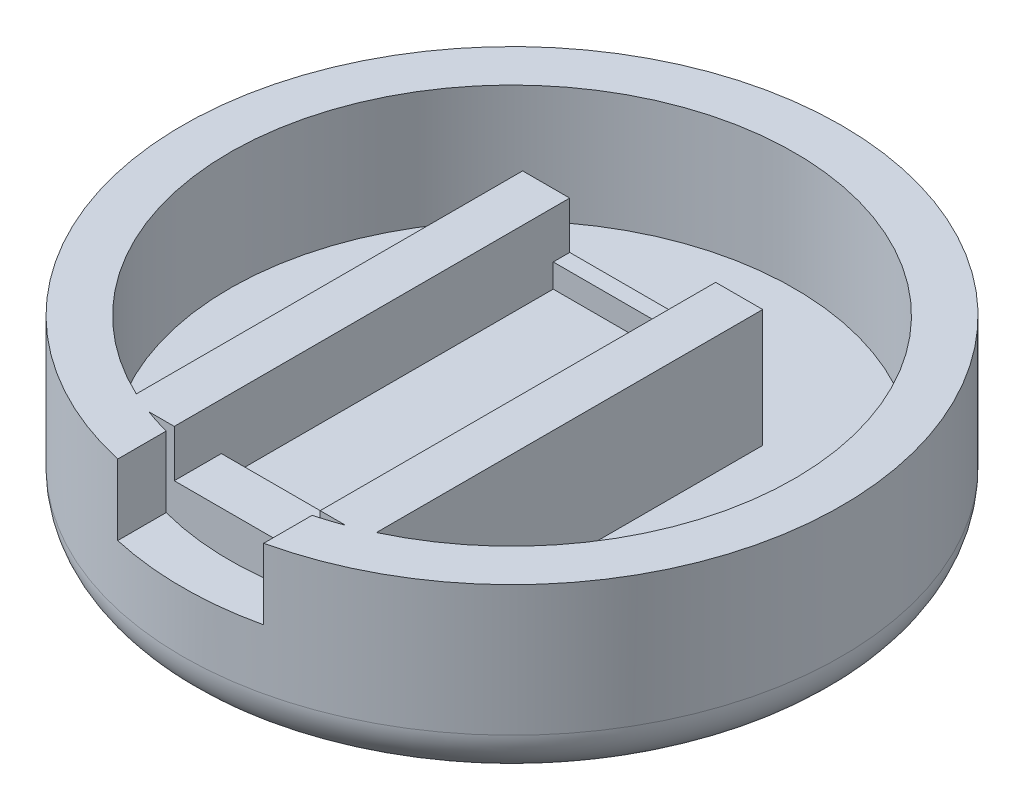
ISO-10303-21;
HEADER;
FILE_DESCRIPTION(('STEP AP214'),'2;1');
FILE_NAME('part.step','',(''),(''),'','','');
FILE_SCHEMA(('AUTOMOTIVE_DESIGN { 1 0 10303 214 1 1 1 1 }'));
ENDSEC;
DATA;
#1=APPLICATION_CONTEXT('core data for automotive mechanical design processes');
#2=APPLICATION_PROTOCOL_DEFINITION('international standard','automotive_design',2000,#1);
#3=PRODUCT_CONTEXT('',#1,'mechanical');
#4=PRODUCT('Part','Part','',(#3));
#5=PRODUCT_RELATED_PRODUCT_CATEGORY('part','',(#4));
#6=PRODUCT_DEFINITION_FORMATION('','',#4);
#7=PRODUCT_DEFINITION_CONTEXT('part definition',#1,'design');
#8=PRODUCT_DEFINITION('design','',#6,#7);
#9=PRODUCT_DEFINITION_SHAPE('','',#8);
#10=(LENGTH_UNIT() NAMED_UNIT(*) SI_UNIT(.MILLI.,.METRE.));
#11=(NAMED_UNIT(*) PLANE_ANGLE_UNIT() SI_UNIT($,.RADIAN.));
#12=(NAMED_UNIT(*) SI_UNIT($,.STERADIAN.) SOLID_ANGLE_UNIT());
#13=UNCERTAINTY_MEASURE_WITH_UNIT(LENGTH_MEASURE(1.E-05),#10,'distance_accuracy_value','');
#14=(GEOMETRIC_REPRESENTATION_CONTEXT(3) GLOBAL_UNCERTAINTY_ASSIGNED_CONTEXT((#13)) GLOBAL_UNIT_ASSIGNED_CONTEXT((#10,
#11,#12)) REPRESENTATION_CONTEXT('',''));
#15=CARTESIAN_POINT('',(0.,0.,0.));
#16=DIRECTION('',(0.,0.,1.));
#17=DIRECTION('',(1.,0.,0.));
#18=AXIS2_PLACEMENT_3D('',#15,#16,#17);
#19=CARTESIAN_POINT('',(0.,3.,0.));
#20=DIRECTION('',(0.,-1.,0.));
#21=DIRECTION('',(0.,0.,-1.));
#22=AXIS2_PLACEMENT_3D('',#19,#20,#21);
#23=PLANE('',#22);
#24=DIRECTION('',(0.,0.,-1.));
#25=VECTOR('',#24,1.);
#26=CARTESIAN_POINT('',(-32.7271495714285,3.,22.0919052857143));
#27=LINE('',#26,#25);
#28=CARTESIAN_POINT('',(-32.7271495714285,3.,16.8747175892936));
#29=VERTEX_POINT('',#28);
#30=CARTESIAN_POINT('',(-32.7271495714285,3.,14.8149153836684));
#31=VERTEX_POINT('',#30);
#32=EDGE_CURVE('E157',#29,#31,#27,.T.);
#33=ORIENTED_EDGE('',*,*,#32,.T.);
#34=CARTESIAN_POINT('',(-29.6271495714285,3.,3.22224528571427));
#35=DIRECTION('',(0.,-1.,0.));
#36=DIRECTION('',(0.,0.,-1.));
#37=AXIS2_PLACEMENT_3D('',#34,#35,#36);
#38=CIRCLE('',#37,12.);
#39=CARTESIAN_POINT('',(-33.8038887163118,3.,14.4719052857143));
#40=VERTEX_POINT('',#39);
#41=EDGE_CURVE('E56',#40,#31,#38,.F.);
#42=ORIENTED_EDGE('',*,*,#41,.F.);
#43=DIRECTION('',(1.,0.,0.));
#44=VECTOR('',#43,1.);
#45=CARTESIAN_POINT('',(-24.5271495714285,3.,14.4719052857143));
#46=LINE('',#45,#44);
#47=CARTESIAN_POINT('',(-32.7271495714285,3.,14.4719052857143));
#48=VERTEX_POINT('',#47);
#49=EDGE_CURVE('E269',#40,#48,#46,.T.);
#50=ORIENTED_EDGE('',*,*,#49,.T.);
#51=DIRECTION('',(0.,0.,1.));
#52=VECTOR('',#51,1.);
#53=CARTESIAN_POINT('',(-32.7271495714285,3.,-1.62809471428573));
#54=LINE('',#53,#52);
#55=CARTESIAN_POINT('',(-32.7271495714285,3.,-2.32809471428573));
#56=VERTEX_POINT('',#55);
#57=EDGE_CURVE('E240',#56,#48,#54,.T.);
#58=ORIENTED_EDGE('',*,*,#57,.F.);
#59=DIRECTION('',(-1.,0.,0.));
#60=VECTOR('',#59,1.);
#61=CARTESIAN_POINT('',(-34.7271495714285,3.,-2.32809471428573));
#62=LINE('',#61,#60);
#63=CARTESIAN_POINT('',(-34.7271495714285,3.,-2.32809471428573));
#64=VERTEX_POINT('',#63);
#65=EDGE_CURVE('E273',#56,#64,#62,.T.);
#66=ORIENTED_EDGE('',*,*,#65,.T.);
#67=DIRECTION('',(0.,0.,1.));
#68=VECTOR('',#67,1.);
#69=CARTESIAN_POINT('',(-34.7271495714285,3.,14.4719052857143));
#70=LINE('',#69,#68);
#71=CARTESIAN_POINT('',(-34.7271495714285,3.,14.0845654798533));
#72=VERTEX_POINT('',#71);
#73=EDGE_CURVE('E265',#64,#72,#70,.T.);
#74=ORIENTED_EDGE('',*,*,#73,.T.);
#75=CARTESIAN_POINT('',(-24.5271495714285,3.,14.0845654798533));
#76=VERTEX_POINT('',#75);
#77=EDGE_CURVE('E178',#76,#72,#38,.F.);
#78=ORIENTED_EDGE('',*,*,#77,.F.);
#79=DIRECTION('',(0.,0.,-1.));
#80=VECTOR('',#79,1.);
#81=CARTESIAN_POINT('',(-24.5271495714285,3.,-2.32809471428573));
#82=LINE('',#81,#80);
#83=CARTESIAN_POINT('',(-24.5271495714285,3.,-2.32809471428573));
#84=VERTEX_POINT('',#83);
#85=EDGE_CURVE('E271',#76,#84,#82,.T.);
#86=ORIENTED_EDGE('',*,*,#85,.T.);
#87=CARTESIAN_POINT('',(-26.5271495714285,3.,-2.32809471428573));
#88=VERTEX_POINT('',#87);
#89=EDGE_CURVE('E274',#84,#88,#62,.T.);
#90=ORIENTED_EDGE('',*,*,#89,.T.);
#91=DIRECTION('',(0.,0.,-1.));
#92=VECTOR('',#91,1.);
#93=CARTESIAN_POINT('',(-26.5271495714285,3.,12.4719052857143));
#94=LINE('',#93,#92);
#95=CARTESIAN_POINT('',(-26.5271495714285,3.,14.4719052857143));
#96=VERTEX_POINT('',#95);
#97=EDGE_CURVE('E243',#96,#88,#94,.T.);
#98=ORIENTED_EDGE('',*,*,#97,.F.);
#99=CARTESIAN_POINT('',(-25.4504104265453,3.,14.4719052857143));
#100=VERTEX_POINT('',#99);
#101=EDGE_CURVE('E268',#96,#100,#46,.T.);
#102=ORIENTED_EDGE('',*,*,#101,.T.);
#103=CARTESIAN_POINT('',(-26.5271495714285,3.,14.8149153836684));
#104=VERTEX_POINT('',#103);
#105=EDGE_CURVE('E181',#104,#100,#38,.F.);
#106=ORIENTED_EDGE('',*,*,#105,.F.);
#107=DIRECTION('',(0.,0.,-1.));
#108=VECTOR('',#107,1.);
#109=CARTESIAN_POINT('',(-26.5271495714285,3.,22.0919052857143));
#110=LINE('',#109,#108);
#111=CARTESIAN_POINT('',(-26.5271495714285,3.,16.8747175892936));
#112=VERTEX_POINT('',#111);
#113=EDGE_CURVE('E166',#112,#104,#110,.T.);
#114=ORIENTED_EDGE('',*,*,#113,.F.);
#115=CARTESIAN_POINT('',(-29.6271495714285,3.,3.22224528571427));
#116=DIRECTION('',(0.,-1.,0.));
#117=DIRECTION('',(0.,0.,-1.));
#118=AXIS2_PLACEMENT_3D('',#115,#116,#117);
#119=CIRCLE('',#118,14.);
#120=EDGE_CURVE('E173',#112,#29,#119,.F.);
#121=ORIENTED_EDGE('',*,*,#120,.T.);
#122=EDGE_LOOP('',(#33,#42,#50,#58,#66,#74,#78,#86,#90,#98,#102,#106,#114,#121));
#123=FACE_BOUND('',#122,.T.);
#124=ADVANCED_FACE('F33',(#123),#23,.F.);
#125=CARTESIAN_POINT('',(-29.6271495714285,42.5979797464467,3.22224528571427));
#126=DIRECTION('',(0.,-1.,0.));
#127=DIRECTION('',(0.,0.,-1.));
#128=AXIS2_PLACEMENT_3D('',#125,#126,#127);
#129=CYLINDRICAL_SURFACE('',#128,12.);
#130=DIRECTION('',(0.,-1.,0.));
#131=VECTOR('',#130,1.);
#132=CARTESIAN_POINT('',(-32.7271495714285,42.5979797464467,14.8149153836684));
#133=LINE('',#132,#131);
#134=CARTESIAN_POINT('',(-32.7271495714285,0.,14.8149153836684));
#135=VERTEX_POINT('',#134);
#136=EDGE_CURVE('E164',#135,#31,#133,.F.);
#137=ORIENTED_EDGE('',*,*,#136,.F.);
#138=CARTESIAN_POINT('',(-29.6271495714285,0.,3.22224528571427));
#139=DIRECTION('',(0.,1.,0.));
#140=DIRECTION('',(0.,0.,1.));
#141=AXIS2_PLACEMENT_3D('',#138,#139,#140);
#142=CIRCLE('',#141,12.);
#143=CARTESIAN_POINT('',(-26.5271495714285,0.,14.8149153836684));
#144=VERTEX_POINT('',#143);
#145=EDGE_CURVE('E508',#144,#135,#142,.F.);
#146=ORIENTED_EDGE('',*,*,#145,.F.);
#147=DIRECTION('',(0.,-1.,0.));
#148=VECTOR('',#147,1.);
#149=CARTESIAN_POINT('',(-26.5271495714285,42.5979797464467,14.8149153836684));
#150=LINE('',#149,#148);
#151=EDGE_CURVE('E510',#104,#144,#150,.T.);
#152=ORIENTED_EDGE('',*,*,#151,.F.);
#153=ORIENTED_EDGE('',*,*,#105,.T.);
#154=DIRECTION('',(0.,-1.,0.));
#155=VECTOR('',#154,1.);
#156=CARTESIAN_POINT('',(-25.4504104265453,42.5979797464467,14.4719052857143));
#157=LINE('',#156,#155);
#158=CARTESIAN_POINT('',(-25.4504104265453,-2.,14.4719052857143));
#159=VERTEX_POINT('',#158);
#160=EDGE_CURVE('E195',#100,#159,#157,.T.);
#161=ORIENTED_EDGE('',*,*,#160,.T.);
#162=CARTESIAN_POINT('',(-29.6271495714285,-2.,3.22224528571427));
#163=DIRECTION('',(0.,-1.,0.));
#164=DIRECTION('',(0.,0.,-1.));
#165=AXIS2_PLACEMENT_3D('',#162,#163,#164);
#166=CIRCLE('',#165,12.);
#167=CARTESIAN_POINT('',(-33.8038887163118,-2.,14.4719052857143));
#168=VERTEX_POINT('',#167);
#169=EDGE_CURVE('E179',#159,#168,#166,.T.);
#170=ORIENTED_EDGE('',*,*,#169,.T.);
#171=DIRECTION('',(0.,-1.,0.));
#172=VECTOR('',#171,1.);
#173=CARTESIAN_POINT('',(-33.8038887163118,42.5979797464467,14.4719052857143));
#174=LINE('',#173,#172);
#175=EDGE_CURVE('E193',#168,#40,#174,.F.);
#176=ORIENTED_EDGE('',*,*,#175,.T.);
#177=ORIENTED_EDGE('',*,*,#41,.T.);
#178=EDGE_LOOP('',(#137,#146,#152,#153,#161,#170,#176,#177));
#179=FACE_BOUND('',#178,.T.);
#180=ADVANCED_FACE('F298',(#179),#129,.F.);
#181=CARTESIAN_POINT('',(-29.6271495714285,42.5979797464467,3.22224528571427));
#182=DIRECTION('',(0.,-1.,0.));
#183=DIRECTION('',(0.,0.,-1.));
#184=AXIS2_PLACEMENT_3D('',#181,#182,#183);
#185=CYLINDRICAL_SURFACE('',#184,14.);
#186=CARTESIAN_POINT('',(-29.6271495714285,-2.54,3.22224528571427));
#187=DIRECTION('',(0.,-1.,0.));
#188=DIRECTION('',(0.,0.,-1.));
#189=AXIS2_PLACEMENT_3D('',#186,#187,#188);
#190=CIRCLE('',#189,14.);
#191=CARTESIAN_POINT('',(-29.6271495714285,-2.54,-10.7777547142857));
#192=VERTEX_POINT('',#191);
#193=EDGE_CURVE('E11',#192,#192,#190,.F.);
#194=ORIENTED_EDGE('',*,*,#193,.T.);
#195=EDGE_LOOP('',(#194));
#196=FACE_BOUND('',#195,.T.);
#197=CARTESIAN_POINT('',(-29.6271495714285,0.,3.22224528571427));
#198=DIRECTION('',(0.,1.,0.));
#199=DIRECTION('',(0.,0.,1.));
#200=AXIS2_PLACEMENT_3D('',#197,#198,#199);
#201=CIRCLE('',#200,14.);
#202=CARTESIAN_POINT('',(-26.5271495714285,0.,16.8747175892936));
#203=VERTEX_POINT('',#202);
#204=CARTESIAN_POINT('',(-32.7271495714285,0.,16.8747175892936));
#205=VERTEX_POINT('',#204);
#206=EDGE_CURVE('E174',#203,#205,#201,.F.);
#207=ORIENTED_EDGE('',*,*,#206,.T.);
#208=DIRECTION('',(0.,-1.,0.));
#209=VECTOR('',#208,1.);
#210=CARTESIAN_POINT('',(-32.7271495714285,42.5979797464467,16.8747175892936));
#211=LINE('',#210,#209);
#212=EDGE_CURVE('E161',#205,#29,#211,.F.);
#213=ORIENTED_EDGE('',*,*,#212,.T.);
#214=ORIENTED_EDGE('',*,*,#120,.F.);
#215=DIRECTION('',(0.,-1.,0.));
#216=VECTOR('',#215,1.);
#217=CARTESIAN_POINT('',(-26.5271495714285,42.5979797464467,16.8747175892936));
#218=LINE('',#217,#216);
#219=EDGE_CURVE('E281',#112,#203,#218,.T.);
#220=ORIENTED_EDGE('',*,*,#219,.T.);
#221=EDGE_LOOP('',(#207,#213,#214,#220));
#222=FACE_BOUND('',#221,.T.);
#223=ADVANCED_FACE('F171',(#196,#222),#185,.T.);
#224=CARTESIAN_POINT('',(-34.7271495714285,3.,14.4719052857143));
#225=DIRECTION('',(1.,0.,0.));
#226=DIRECTION('',(0.,0.,-1.));
#227=AXIS2_PLACEMENT_3D('',#224,#225,#226);
#228=PLANE('',#227);
#229=DIRECTION('',(0.,-1.,0.));
#230=VECTOR('',#229,1.);
#231=CARTESIAN_POINT('',(-34.7271495714285,42.5979797464467,14.0845654798533));
#232=LINE('',#231,#230);
#233=CARTESIAN_POINT('',(-34.7271495714285,-2.,14.0845654798533));
#234=VERTEX_POINT('',#233);
#235=EDGE_CURVE('E197',#72,#234,#232,.T.);
#236=ORIENTED_EDGE('',*,*,#235,.F.);
#237=ORIENTED_EDGE('',*,*,#73,.F.);
#238=DIRECTION('',(0.,-1.,0.));
#239=VECTOR('',#238,1.);
#240=CARTESIAN_POINT('',(-34.7271495714285,3.,-2.32809471428573));
#241=LINE('',#240,#239);
#242=CARTESIAN_POINT('',(-34.7271495714285,-2.,-2.32809471428573));
#243=VERTEX_POINT('',#242);
#244=EDGE_CURVE('E277',#64,#243,#241,.T.);
#245=ORIENTED_EDGE('',*,*,#244,.T.);
#246=DIRECTION('',(0.,0.,-1.));
#247=VECTOR('',#246,1.);
#248=CARTESIAN_POINT('',(-34.7271495714285,-2.,14.4719052857143));
#249=LINE('',#248,#247);
#250=EDGE_CURVE('E199',#234,#243,#249,.T.);
#251=ORIENTED_EDGE('',*,*,#250,.F.);
#252=EDGE_LOOP('',(#236,#237,#245,#251));
#253=FACE_BOUND('',#252,.T.);
#254=ADVANCED_FACE('F321',(#253),#228,.F.);
#255=CARTESIAN_POINT('',(-24.5271495714285,3.,14.4719052857143));
#256=DIRECTION('',(0.,0.,-1.));
#257=DIRECTION('',(-1.,0.,0.));
#258=AXIS2_PLACEMENT_3D('',#255,#256,#257);
#259=PLANE('',#258);
#260=DIRECTION('',(1.,0.,0.));
#261=VECTOR('',#260,1.);
#262=CARTESIAN_POINT('',(-32.7271495714285,1.,14.4719052857143));
#263=LINE('',#262,#261);
#264=CARTESIAN_POINT('',(-32.7271495714285,1.,14.4719052857143));
#265=VERTEX_POINT('',#264);
#266=CARTESIAN_POINT('',(-26.5271495714285,1.,14.4719052857143));
#267=VERTEX_POINT('',#266);
#268=EDGE_CURVE('E214',#265,#267,#263,.T.);
#269=ORIENTED_EDGE('',*,*,#268,.F.);
#270=DIRECTION('',(0.,-1.,0.));
#271=VECTOR('',#270,1.);
#272=CARTESIAN_POINT('',(-32.7271495714285,3.,14.4719052857143));
#273=LINE('',#272,#271);
#274=EDGE_CURVE('E211',#48,#265,#273,.T.);
#275=ORIENTED_EDGE('',*,*,#274,.F.);
#276=ORIENTED_EDGE('',*,*,#49,.F.);
#277=ORIENTED_EDGE('',*,*,#175,.F.);
#278=DIRECTION('',(-1.,0.,0.));
#279=VECTOR('',#278,1.);
#280=CARTESIAN_POINT('',(-34.7271495714285,-2.,14.4719052857143));
#281=LINE('',#280,#279);
#282=EDGE_CURVE('E208',#159,#168,#281,.T.);
#283=ORIENTED_EDGE('',*,*,#282,.F.);
#284=ORIENTED_EDGE('',*,*,#160,.F.);
#285=ORIENTED_EDGE('',*,*,#101,.F.);
#286=DIRECTION('',(0.,1.,0.));
#287=VECTOR('',#286,1.);
#288=CARTESIAN_POINT('',(-26.5271495714285,3.,14.4719052857143));
#289=LINE('',#288,#287);
#290=EDGE_CURVE('E217',#267,#96,#289,.T.);
#291=ORIENTED_EDGE('',*,*,#290,.F.);
#292=EDGE_LOOP('',(#269,#275,#276,#277,#283,#284,#285,#291));
#293=FACE_BOUND('',#292,.T.);
#294=ADVANCED_FACE('F318',(#293),#259,.F.);
#295=CARTESIAN_POINT('',(-24.5271495714285,3.,-2.32809471428573));
#296=DIRECTION('',(-1.,0.,0.));
#297=DIRECTION('',(0.,0.,1.));
#298=AXIS2_PLACEMENT_3D('',#295,#296,#297);
#299=PLANE('',#298);
#300=DIRECTION('',(0.,-1.,0.));
#301=VECTOR('',#300,1.);
#302=CARTESIAN_POINT('',(-24.5271495714285,42.5979797464467,14.0845654798533));
#303=LINE('',#302,#301);
#304=CARTESIAN_POINT('',(-24.5271495714285,-2.,14.0845654798533));
#305=VERTEX_POINT('',#304);
#306=EDGE_CURVE('E190',#305,#76,#303,.F.);
#307=ORIENTED_EDGE('',*,*,#306,.F.);
#308=DIRECTION('',(0.,0.,1.));
#309=VECTOR('',#308,1.);
#310=CARTESIAN_POINT('',(-24.5271495714285,-2.,14.4719052857143));
#311=LINE('',#310,#309);
#312=CARTESIAN_POINT('',(-24.5271495714285,-2.,-2.32809471428573));
#313=VERTEX_POINT('',#312);
#314=EDGE_CURVE('E205',#313,#305,#311,.T.);
#315=ORIENTED_EDGE('',*,*,#314,.F.);
#316=DIRECTION('',(0.,-1.,0.));
#317=VECTOR('',#316,1.);
#318=CARTESIAN_POINT('',(-24.5271495714285,3.,-2.32809471428573));
#319=LINE('',#318,#317);
#320=EDGE_CURVE('E279',#84,#313,#319,.T.);
#321=ORIENTED_EDGE('',*,*,#320,.F.);
#322=ORIENTED_EDGE('',*,*,#85,.F.);
#323=EDGE_LOOP('',(#307,#315,#321,#322));
#324=FACE_BOUND('',#323,.T.);
#325=ADVANCED_FACE('F314',(#324),#299,.F.);
#326=CARTESIAN_POINT('',(-34.7271495714285,3.,-2.32809471428573));
#327=DIRECTION('',(0.,0.,1.));
#328=DIRECTION('',(1.,0.,0.));
#329=AXIS2_PLACEMENT_3D('',#326,#327,#328);
#330=PLANE('',#329);
#331=ORIENTED_EDGE('',*,*,#65,.F.);
#332=DIRECTION('',(0.,-1.,0.));
#333=VECTOR('',#332,1.);
#334=CARTESIAN_POINT('',(-32.7271495714285,3.,-2.32809471428573));
#335=LINE('',#334,#333);
#336=CARTESIAN_POINT('',(-32.7271495714285,1.,-2.32809471428573));
#337=VERTEX_POINT('',#336);
#338=EDGE_CURVE('E236',#56,#337,#335,.T.);
#339=ORIENTED_EDGE('',*,*,#338,.T.);
#340=DIRECTION('',(1.,0.,0.));
#341=VECTOR('',#340,1.);
#342=CARTESIAN_POINT('',(-34.7271495714285,1.,-2.32809471428573));
#343=LINE('',#342,#341);
#344=CARTESIAN_POINT('',(-26.5271495714285,1.,-2.32809471428573));
#345=VERTEX_POINT('',#344);
#346=EDGE_CURVE('E230',#337,#345,#343,.T.);
#347=ORIENTED_EDGE('',*,*,#346,.T.);
#348=DIRECTION('',(0.,1.,0.));
#349=VECTOR('',#348,1.);
#350=CARTESIAN_POINT('',(-26.5271495714285,3.,-2.32809471428573));
#351=LINE('',#350,#349);
#352=EDGE_CURVE('E233',#345,#88,#351,.T.);
#353=ORIENTED_EDGE('',*,*,#352,.T.);
#354=ORIENTED_EDGE('',*,*,#89,.F.);
#355=ORIENTED_EDGE('',*,*,#320,.T.);
#356=DIRECTION('',(1.,0.,0.));
#357=VECTOR('',#356,1.);
#358=CARTESIAN_POINT('',(-34.7271495714285,-2.,-2.32809471428573));
#359=LINE('',#358,#357);
#360=EDGE_CURVE('E202',#243,#313,#359,.T.);
#361=ORIENTED_EDGE('',*,*,#360,.F.);
#362=ORIENTED_EDGE('',*,*,#244,.F.);
#363=EDGE_LOOP('',(#331,#339,#347,#353,#354,#355,#361,#362));
#364=FACE_BOUND('',#363,.T.);
#365=ADVANCED_FACE('F311',(#364),#330,.F.);
#366=CARTESIAN_POINT('',(-26.5271495714285,3.,-1.62809471428573));
#367=DIRECTION('',(0.,0.,1.));
#368=DIRECTION('',(1.,0.,0.));
#369=AXIS2_PLACEMENT_3D('',#366,#367,#368);
#370=PLANE('',#369);
#371=DIRECTION('',(1.,0.,0.));
#372=VECTOR('',#371,1.);
#373=CARTESIAN_POINT('',(-26.5271495714285,1.,-1.62809471428573));
#374=LINE('',#373,#372);
#375=CARTESIAN_POINT('',(-32.7271495714285,1.,-1.62809471428573));
#376=VERTEX_POINT('',#375);
#377=CARTESIAN_POINT('',(-26.5271495714285,1.,-1.62809471428573));
#378=VERTEX_POINT('',#377);
#379=EDGE_CURVE('E228',#376,#378,#374,.T.);
#380=ORIENTED_EDGE('',*,*,#379,.F.);
#381=DIRECTION('',(0.,-1.,0.));
#382=VECTOR('',#381,1.);
#383=CARTESIAN_POINT('',(-32.7271495714285,3.,-1.62809471428573));
#384=LINE('',#383,#382);
#385=CARTESIAN_POINT('',(-32.7271495714285,0.,-1.62809471428573));
#386=VERTEX_POINT('',#385);
#387=EDGE_CURVE('E263',#376,#386,#384,.T.);
#388=ORIENTED_EDGE('',*,*,#387,.T.);
#389=DIRECTION('',(-1.,0.,0.));
#390=VECTOR('',#389,1.);
#391=CARTESIAN_POINT('',(-26.5271495714285,0.,-1.62809471428573));
#392=LINE('',#391,#390);
#393=CARTESIAN_POINT('',(-26.5271495714285,0.,-1.62809471428573));
#394=VERTEX_POINT('',#393);
#395=EDGE_CURVE('E239',#394,#386,#392,.T.);
#396=ORIENTED_EDGE('',*,*,#395,.F.);
#397=DIRECTION('',(0.,-1.,0.));
#398=VECTOR('',#397,1.);
#399=CARTESIAN_POINT('',(-26.5271495714285,3.,-1.62809471428573));
#400=LINE('',#399,#398);
#401=EDGE_CURVE('E246',#378,#394,#400,.T.);
#402=ORIENTED_EDGE('',*,*,#401,.F.);
#403=EDGE_LOOP('',(#380,#388,#396,#402));
#404=FACE_BOUND('',#403,.T.);
#405=ADVANCED_FACE('F309',(#404),#370,.T.);
#406=CARTESIAN_POINT('',(-32.7271495714285,3.,-1.62809471428573));
#407=DIRECTION('',(1.,0.,0.));
#408=DIRECTION('',(0.,0.,-1.));
#409=AXIS2_PLACEMENT_3D('',#406,#407,#408);
#410=PLANE('',#409);
#411=ORIENTED_EDGE('',*,*,#387,.F.);
#412=DIRECTION('',(0.,0.,1.));
#413=VECTOR('',#412,1.);
#414=CARTESIAN_POINT('',(-32.7271495714285,1.,-10.9280947142857));
#415=LINE('',#414,#413);
#416=EDGE_CURVE('E224',#337,#376,#415,.T.);
#417=ORIENTED_EDGE('',*,*,#416,.F.);
#418=ORIENTED_EDGE('',*,*,#338,.F.);
#419=ORIENTED_EDGE('',*,*,#57,.T.);
#420=ORIENTED_EDGE('',*,*,#274,.T.);
#421=CARTESIAN_POINT('',(-32.7271495714285,1.,12.4719052857143));
#422=VERTEX_POINT('',#421);
#423=EDGE_CURVE('E220',#422,#265,#415,.T.);
#424=ORIENTED_EDGE('',*,*,#423,.F.);
#425=DIRECTION('',(0.,-1.,0.));
#426=VECTOR('',#425,1.);
#427=CARTESIAN_POINT('',(-32.7271495714285,3.,12.4719052857143));
#428=LINE('',#427,#426);
#429=CARTESIAN_POINT('',(-32.7271495714285,0.,12.4719052857143));
#430=VERTEX_POINT('',#429);
#431=EDGE_CURVE('E261',#422,#430,#428,.T.);
#432=ORIENTED_EDGE('',*,*,#431,.T.);
#433=DIRECTION('',(0.,0.,1.));
#434=VECTOR('',#433,1.);
#435=CARTESIAN_POINT('',(-32.7271495714285,0.,-1.62809471428573));
#436=LINE('',#435,#434);
#437=EDGE_CURVE('E249',#386,#430,#436,.T.);
#438=ORIENTED_EDGE('',*,*,#437,.F.);
#439=EDGE_LOOP('',(#411,#417,#418,#419,#420,#424,#432,#438));
#440=FACE_BOUND('',#439,.T.);
#441=ADVANCED_FACE('F362',(#440),#410,.T.);
#442=CARTESIAN_POINT('',(-32.7271495714285,3.,12.4719052857143));
#443=DIRECTION('',(0.,0.,-1.));
#444=DIRECTION('',(-1.,0.,0.));
#445=AXIS2_PLACEMENT_3D('',#442,#443,#444);
#446=PLANE('',#445);
#447=DIRECTION('',(-1.,0.,0.));
#448=VECTOR('',#447,1.);
#449=CARTESIAN_POINT('',(-32.7271495714285,1.,12.4719052857143));
#450=LINE('',#449,#448);
#451=CARTESIAN_POINT('',(-26.5271495714285,1.,12.4719052857143));
#452=VERTEX_POINT('',#451);
#453=EDGE_CURVE('E226',#452,#422,#450,.T.);
#454=ORIENTED_EDGE('',*,*,#453,.F.);
#455=DIRECTION('',(0.,-1.,0.));
#456=VECTOR('',#455,1.);
#457=CARTESIAN_POINT('',(-26.5271495714285,3.,12.4719052857143));
#458=LINE('',#457,#456);
#459=CARTESIAN_POINT('',(-26.5271495714285,0.,12.4719052857143));
#460=VERTEX_POINT('',#459);
#461=EDGE_CURVE('E258',#452,#460,#458,.T.);
#462=ORIENTED_EDGE('',*,*,#461,.T.);
#463=DIRECTION('',(1.,0.,0.));
#464=VECTOR('',#463,1.);
#465=CARTESIAN_POINT('',(-32.7271495714285,0.,12.4719052857143));
#466=LINE('',#465,#464);
#467=EDGE_CURVE('E252',#430,#460,#466,.T.);
#468=ORIENTED_EDGE('',*,*,#467,.F.);
#469=ORIENTED_EDGE('',*,*,#431,.F.);
#470=EDGE_LOOP('',(#454,#462,#468,#469));
#471=FACE_BOUND('',#470,.T.);
#472=ADVANCED_FACE('F370',(#471),#446,.T.);
#473=CARTESIAN_POINT('',(-26.5271495714285,3.,12.4719052857143));
#474=DIRECTION('',(-1.,0.,0.));
#475=DIRECTION('',(0.,0.,1.));
#476=AXIS2_PLACEMENT_3D('',#473,#474,#475);
#477=PLANE('',#476);
#478=ORIENTED_EDGE('',*,*,#461,.F.);
#479=DIRECTION('',(0.,0.,1.));
#480=VECTOR('',#479,1.);
#481=CARTESIAN_POINT('',(-26.5271495714285,1.,-10.9280947142857));
#482=LINE('',#481,#480);
#483=EDGE_CURVE('E221',#452,#267,#482,.T.);
#484=ORIENTED_EDGE('',*,*,#483,.T.);
#485=ORIENTED_EDGE('',*,*,#290,.T.);
#486=ORIENTED_EDGE('',*,*,#97,.T.);
#487=ORIENTED_EDGE('',*,*,#352,.F.);
#488=EDGE_CURVE('E223',#345,#378,#482,.T.);
#489=ORIENTED_EDGE('',*,*,#488,.T.);
#490=ORIENTED_EDGE('',*,*,#401,.T.);
#491=DIRECTION('',(0.,0.,-1.));
#492=VECTOR('',#491,1.);
#493=CARTESIAN_POINT('',(-26.5271495714285,0.,12.4719052857143));
#494=LINE('',#493,#492);
#495=EDGE_CURVE('E244',#460,#394,#494,.T.);
#496=ORIENTED_EDGE('',*,*,#495,.F.);
#497=EDGE_LOOP('',(#478,#484,#485,#486,#487,#489,#490,#496));
#498=FACE_BOUND('',#497,.T.);
#499=ADVANCED_FACE('F351',(#498),#477,.T.);
#500=CARTESIAN_POINT('',(-32.7271495714285,1.,-10.9280947142857));
#501=DIRECTION('',(0.,-1.,0.));
#502=DIRECTION('',(0.,0.,-1.));
#503=AXIS2_PLACEMENT_3D('',#500,#501,#502);
#504=PLANE('',#503);
#505=ORIENTED_EDGE('',*,*,#453,.T.);
#506=ORIENTED_EDGE('',*,*,#423,.T.);
#507=ORIENTED_EDGE('',*,*,#268,.T.);
#508=ORIENTED_EDGE('',*,*,#483,.F.);
#509=EDGE_LOOP('',(#505,#506,#507,#508));
#510=FACE_BOUND('',#509,.T.);
#511=ADVANCED_FACE('F372',(#510),#504,.F.);
#512=ORIENTED_EDGE('',*,*,#416,.T.);
#513=ORIENTED_EDGE('',*,*,#379,.T.);
#514=ORIENTED_EDGE('',*,*,#488,.F.);
#515=ORIENTED_EDGE('',*,*,#346,.F.);
#516=EDGE_LOOP('',(#512,#513,#514,#515));
#517=FACE_BOUND('',#516,.T.);
#518=ADVANCED_FACE('F354',(#517),#504,.F.);
#519=CARTESIAN_POINT('',(0.,0.,0.));
#520=DIRECTION('',(0.,-1.,0.));
#521=DIRECTION('',(0.,0.,-1.));
#522=AXIS2_PLACEMENT_3D('',#519,#520,#521);
#523=PLANE('',#522);
#524=ORIENTED_EDGE('',*,*,#467,.T.);
#525=ORIENTED_EDGE('',*,*,#495,.T.);
#526=ORIENTED_EDGE('',*,*,#395,.T.);
#527=ORIENTED_EDGE('',*,*,#437,.T.);
#528=EDGE_LOOP('',(#524,#525,#526,#527));
#529=FACE_BOUND('',#528,.T.);
#530=ADVANCED_FACE('F367',(#529),#523,.F.);
#531=ORIENTED_EDGE('',*,*,#77,.T.);
#532=ORIENTED_EDGE('',*,*,#235,.T.);
#533=EDGE_CURVE('E184',#234,#305,#166,.T.);
#534=ORIENTED_EDGE('',*,*,#533,.T.);
#535=ORIENTED_EDGE('',*,*,#306,.T.);
#536=EDGE_LOOP('',(#531,#532,#534,#535));
#537=FACE_BOUND('',#536,.T.);
#538=ADVANCED_FACE('F306',(#537),#129,.F.);
#539=CARTESIAN_POINT('',(-29.6271495714285,-2.,3.22224528571427));
#540=DIRECTION('',(0.,-1.,0.));
#541=DIRECTION('',(0.,0.,-1.));
#542=AXIS2_PLACEMENT_3D('',#539,#540,#541);
#543=PLANE('',#542);
#544=ORIENTED_EDGE('',*,*,#169,.F.);
#545=ORIENTED_EDGE('',*,*,#282,.T.);
#546=EDGE_LOOP('',(#544,#545));
#547=FACE_BOUND('',#546,.T.);
#548=ADVANCED_FACE('F384',(#547),#543,.F.);
#549=ORIENTED_EDGE('',*,*,#533,.F.);
#550=ORIENTED_EDGE('',*,*,#250,.T.);
#551=ORIENTED_EDGE('',*,*,#360,.T.);
#552=ORIENTED_EDGE('',*,*,#314,.T.);
#553=EDGE_LOOP('',(#549,#550,#551,#552));
#554=FACE_BOUND('',#553,.T.);
#555=ADVANCED_FACE('F344',(#554),#543,.F.);
#556=CARTESIAN_POINT('',(-29.6271495714285,-4.54,3.22224528571427));
#557=DIRECTION('',(0.,-1.,0.));
#558=DIRECTION('',(0.,0.,-1.));
#559=AXIS2_PLACEMENT_3D('',#556,#557,#558);
#560=PLANE('',#559);
#561=CARTESIAN_POINT('',(-29.6271495714285,-4.54,3.22224528571427));
#562=DIRECTION('',(0.,-1.,0.));
#563=DIRECTION('',(0.,0.,-1.));
#564=AXIS2_PLACEMENT_3D('',#561,#562,#563);
#565=CIRCLE('',#564,12.);
#566=CARTESIAN_POINT('',(-29.6271495714285,-4.54,-8.77775471428574));
#567=VERTEX_POINT('',#566);
#568=EDGE_CURVE('E41',#567,#567,#565,.T.);
#569=ORIENTED_EDGE('',*,*,#568,.T.);
#570=EDGE_LOOP('',(#569));
#571=FACE_BOUND('',#570,.T.);
#572=ADVANCED_FACE('F286',(#571),#560,.T.);
#573=CARTESIAN_POINT('',(-32.7271495714285,3.,22.0919052857143));
#574=DIRECTION('',(1.,0.,0.));
#575=DIRECTION('',(0.,0.,-1.));
#576=AXIS2_PLACEMENT_3D('',#573,#574,#575);
#577=PLANE('',#576);
#578=ORIENTED_EDGE('',*,*,#136,.T.);
#579=ORIENTED_EDGE('',*,*,#32,.F.);
#580=ORIENTED_EDGE('',*,*,#212,.F.);
#581=DIRECTION('',(0.,0.,-1.));
#582=VECTOR('',#581,1.);
#583=CARTESIAN_POINT('',(-32.7271495714285,0.,22.0919052857143));
#584=LINE('',#583,#582);
#585=EDGE_CURVE('E509',#205,#135,#584,.T.);
#586=ORIENTED_EDGE('',*,*,#585,.T.);
#587=EDGE_LOOP('',(#578,#579,#580,#586));
#588=FACE_BOUND('',#587,.T.);
#589=ADVANCED_FACE('F159',(#588),#577,.T.);
#590=CARTESIAN_POINT('',(-32.7271495714285,0.,22.0919052857143));
#591=DIRECTION('',(0.,1.,0.));
#592=DIRECTION('',(0.,0.,1.));
#593=AXIS2_PLACEMENT_3D('',#590,#591,#592);
#594=PLANE('',#593);
#595=ORIENTED_EDGE('',*,*,#145,.T.);
#596=ORIENTED_EDGE('',*,*,#585,.F.);
#597=ORIENTED_EDGE('',*,*,#206,.F.);
#598=DIRECTION('',(0.,0.,-1.));
#599=VECTOR('',#598,1.);
#600=CARTESIAN_POINT('',(-26.5271495714285,0.,22.0919052857143));
#601=LINE('',#600,#599);
#602=EDGE_CURVE('E48',#203,#144,#601,.T.);
#603=ORIENTED_EDGE('',*,*,#602,.T.);
#604=EDGE_LOOP('',(#595,#596,#597,#603));
#605=FACE_BOUND('',#604,.T.);
#606=ADVANCED_FACE('F294',(#605),#594,.T.);
#607=CARTESIAN_POINT('',(-26.5271495714285,3.,22.0919052857143));
#608=DIRECTION('',(-1.,0.,0.));
#609=DIRECTION('',(0.,0.,1.));
#610=AXIS2_PLACEMENT_3D('',#607,#608,#609);
#611=PLANE('',#610);
#612=ORIENTED_EDGE('',*,*,#151,.T.);
#613=ORIENTED_EDGE('',*,*,#602,.F.);
#614=ORIENTED_EDGE('',*,*,#219,.F.);
#615=ORIENTED_EDGE('',*,*,#113,.T.);
#616=EDGE_LOOP('',(#612,#613,#614,#615));
#617=FACE_BOUND('',#616,.T.);
#618=ADVANCED_FACE('F289',(#617),#611,.T.);
#619=CARTESIAN_POINT('',(-29.6271495714285,-2.54,3.22224528571427));
#620=DIRECTION('',(0.,-1.,0.));
#621=DIRECTION('',(0.,0.,-1.));
#622=AXIS2_PLACEMENT_3D('',#619,#620,#621);
#623=TOROIDAL_SURFACE('',#622,12.,2.);
#624=ORIENTED_EDGE('',*,*,#193,.F.);
#625=EDGE_LOOP('',(#624));
#626=FACE_BOUND('',#625,.T.);
#627=ORIENTED_EDGE('',*,*,#568,.F.);
#628=EDGE_LOOP('',(#627));
#629=FACE_BOUND('',#628,.T.);
#630=ADVANCED_FACE('F35',(#626,#629),#623,.T.);
#631=CLOSED_SHELL('',(#124,#180,#223,#254,#294,#325,#365,#405,#441,#472,#499,#511,#518,#530,
#538,#548,#555,#572,#589,#606,#618,#630));
#632=MANIFOLD_SOLID_BREP('B2',#631);
#633=ADVANCED_BREP_SHAPE_REPRESENTATION('',(#18,#632),#14);
#634=SHAPE_DEFINITION_REPRESENTATION(#9,#633);
ENDSEC;
END-ISO-10303-21;
